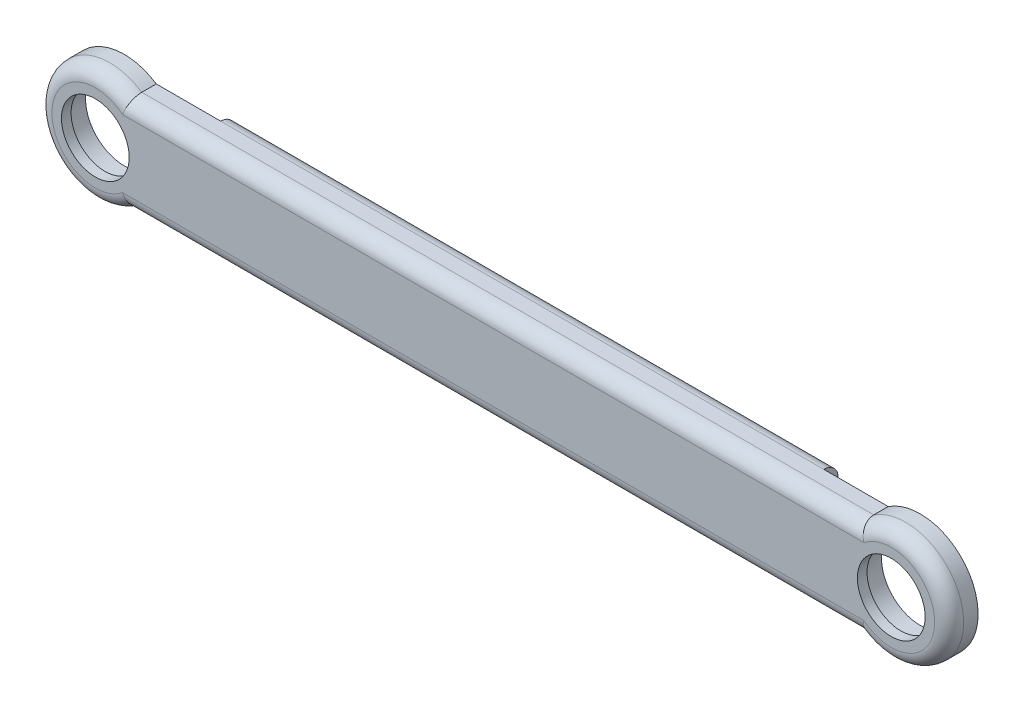
ISO-10303-21;
HEADER;
FILE_DESCRIPTION(('STEP AP214'),'2;1');
FILE_NAME('part.step','',(''),(''),'','','');
FILE_SCHEMA(('AUTOMOTIVE_DESIGN { 1 0 10303 214 1 1 1 1 }'));
ENDSEC;
DATA;
#1=APPLICATION_CONTEXT('core data for automotive mechanical design processes');
#2=APPLICATION_PROTOCOL_DEFINITION('international standard','automotive_design',2000,#1);
#3=PRODUCT_CONTEXT('',#1,'mechanical');
#4=PRODUCT('Part','Part','',(#3));
#5=PRODUCT_RELATED_PRODUCT_CATEGORY('part','',(#4));
#6=PRODUCT_DEFINITION_FORMATION('','',#4);
#7=PRODUCT_DEFINITION_CONTEXT('part definition',#1,'design');
#8=PRODUCT_DEFINITION('design','',#6,#7);
#9=PRODUCT_DEFINITION_SHAPE('','',#8);
#10=(LENGTH_UNIT() NAMED_UNIT(*) SI_UNIT(.MILLI.,.METRE.));
#11=(NAMED_UNIT(*) PLANE_ANGLE_UNIT() SI_UNIT($,.RADIAN.));
#12=(NAMED_UNIT(*) SI_UNIT($,.STERADIAN.) SOLID_ANGLE_UNIT());
#13=UNCERTAINTY_MEASURE_WITH_UNIT(LENGTH_MEASURE(1.E-05),#10,'distance_accuracy_value','');
#14=(GEOMETRIC_REPRESENTATION_CONTEXT(3) GLOBAL_UNCERTAINTY_ASSIGNED_CONTEXT((#13)) GLOBAL_UNIT_ASSIGNED_CONTEXT((#10,
#11,#12)) REPRESENTATION_CONTEXT('',''));
#15=CARTESIAN_POINT('',(0.,0.,0.));
#16=DIRECTION('',(0.,0.,1.));
#17=DIRECTION('',(1.,0.,0.));
#18=AXIS2_PLACEMENT_3D('',#15,#16,#17);
#19=CARTESIAN_POINT('',(-17.9046469247353,-12.01,3.));
#20=DIRECTION('',(0.,0.,1.));
#21=DIRECTION('',(1.,0.,0.));
#22=AXIS2_PLACEMENT_3D('',#19,#20,#21);
#23=PLANE('',#22);
#24=CARTESIAN_POINT('',(0.,0.,3.));
#25=DIRECTION('',(0.,0.,1.));
#26=DIRECTION('',(1.,0.,0.));
#27=AXIS2_PLACEMENT_3D('',#24,#25,#26);
#28=CIRCLE('',#27,8.025);
#29=CARTESIAN_POINT('',(-8.025,0.,3.));
#30=VERTEX_POINT('',#29);
#31=EDGE_CURVE('E174',#30,#30,#28,.T.);
#32=ORIENTED_EDGE('',*,*,#31,.T.);
#33=EDGE_LOOP('',(#32));
#34=FACE_BOUND('',#33,.T.);
#35=DIRECTION('',(1.,0.,0.));
#36=VECTOR('',#35,1.);
#37=CARTESIAN_POINT('',(6.6332495807108,10.,3.));
#38=LINE('',#37,#36);
#39=CARTESIAN_POINT('',(20.,10.,3.));
#40=VERTEX_POINT('',#39);
#41=CARTESIAN_POINT('',(6.6332495807108,10.,3.));
#42=VERTEX_POINT('',#41);
#43=EDGE_CURVE('E134',#40,#42,#38,.F.);
#44=ORIENTED_EDGE('',*,*,#43,.F.);
#45=DIRECTION('',(0.,1.,0.));
#46=VECTOR('',#45,1.);
#47=CARTESIAN_POINT('',(20.,-12.01,3.));
#48=LINE('',#47,#46);
#49=CARTESIAN_POINT('',(20.,-10.,3.));
#50=VERTEX_POINT('',#49);
#51=EDGE_CURVE('E50',#50,#40,#48,.T.);
#52=ORIENTED_EDGE('',*,*,#51,.F.);
#53=DIRECTION('',(1.,0.,0.));
#54=VECTOR('',#53,1.);
#55=CARTESIAN_POINT('',(6.6332495807108,-10.,3.));
#56=LINE('',#55,#54);
#57=CARTESIAN_POINT('',(6.6332495807108,-10.,3.));
#58=VERTEX_POINT('',#57);
#59=EDGE_CURVE('E123',#58,#50,#56,.T.);
#60=ORIENTED_EDGE('',*,*,#59,.F.);
#61=CARTESIAN_POINT('',(0.,0.,3.));
#62=DIRECTION('',(0.,0.,1.));
#63=DIRECTION('',(1.,0.,0.));
#64=AXIS2_PLACEMENT_3D('',#61,#62,#63);
#65=CIRCLE('',#64,12.);
#66=EDGE_CURVE('E70',#42,#58,#65,.T.);
#67=ORIENTED_EDGE('',*,*,#66,.F.);
#68=EDGE_LOOP('',(#44,#52,#60,#67));
#69=FACE_BOUND('',#68,.T.);
#70=CARTESIAN_POINT('',(13.,0.,3.));
#71=DIRECTION('',(0.,0.,1.));
#72=DIRECTION('',(1.,0.,0.));
#73=AXIS2_PLACEMENT_3D('',#70,#71,#72);
#74=CIRCLE('',#73,2.2);
#75=CARTESIAN_POINT('',(15.2,0.,3.));
#76=VERTEX_POINT('',#75);
#77=EDGE_CURVE('E137',#76,#76,#74,.T.);
#78=ORIENTED_EDGE('',*,*,#77,.T.);
#79=EDGE_LOOP('',(#78));
#80=FACE_BOUND('',#79,.T.);
#81=ADVANCED_FACE('F43',(#34,#69,#80),#23,.F.);
#82=CARTESIAN_POINT('',(20.,-12.01,3.));
#83=DIRECTION('',(1.,0.,0.));
#84=DIRECTION('',(0.,0.,-1.));
#85=AXIS2_PLACEMENT_3D('',#82,#83,#84);
#86=PLANE('',#85);
#87=CARTESIAN_POINT('',(20.,7.,3.));
#88=DIRECTION('',(1.,0.,0.));
#89=DIRECTION('',(0.,0.,-1.));
#90=AXIS2_PLACEMENT_3D('',#87,#88,#89);
#91=CIRCLE('',#90,3.);
#92=CARTESIAN_POINT('',(20.,7.,0.));
#93=VERTEX_POINT('',#92);
#94=EDGE_CURVE('E150',#40,#93,#91,.F.);
#95=ORIENTED_EDGE('',*,*,#94,.T.);
#96=DIRECTION('',(0.,1.,0.));
#97=VECTOR('',#96,1.);
#98=CARTESIAN_POINT('',(20.,0.,0.));
#99=LINE('',#98,#97);
#100=CARTESIAN_POINT('',(20.,-7.,0.));
#101=VERTEX_POINT('',#100);
#102=EDGE_CURVE('E142',#101,#93,#99,.T.);
#103=ORIENTED_EDGE('',*,*,#102,.F.);
#104=CARTESIAN_POINT('',(20.,-7.,3.));
#105=DIRECTION('',(1.,0.,0.));
#106=DIRECTION('',(0.,0.,-1.));
#107=AXIS2_PLACEMENT_3D('',#104,#105,#106);
#108=CIRCLE('',#107,3.);
#109=EDGE_CURVE('E141',#101,#50,#108,.F.);
#110=ORIENTED_EDGE('',*,*,#109,.T.);
#111=ORIENTED_EDGE('',*,*,#51,.T.);
#112=EDGE_LOOP('',(#95,#103,#110,#111));
#113=FACE_BOUND('',#112,.T.);
#114=ADVANCED_FACE('F145',(#113),#86,.F.);
#115=CARTESIAN_POINT('',(182.904646924735,-12.01,3.));
#116=DIRECTION('',(0.,0.,-1.));
#117=DIRECTION('',(-1.,0.,0.));
#118=AXIS2_PLACEMENT_3D('',#115,#116,#117);
#119=PLANE('',#118);
#120=CARTESIAN_POINT('',(165.,0.,3.));
#121=DIRECTION('',(0.,0.,-1.));
#122=DIRECTION('',(-1.,0.,0.));
#123=AXIS2_PLACEMENT_3D('',#120,#121,#122);
#124=CIRCLE('',#123,8.025);
#125=CARTESIAN_POINT('',(156.975,0.,3.));
#126=VERTEX_POINT('',#125);
#127=EDGE_CURVE('E173',#126,#126,#124,.F.);
#128=ORIENTED_EDGE('',*,*,#127,.T.);
#129=EDGE_LOOP('',(#128));
#130=FACE_BOUND('',#129,.T.);
#131=CARTESIAN_POINT('',(158.366750419289,10.,3.));
#132=VERTEX_POINT('',#131);
#133=CARTESIAN_POINT('',(145.,10.,3.));
#134=VERTEX_POINT('',#133);
#135=EDGE_CURVE('E153',#132,#134,#38,.F.);
#136=ORIENTED_EDGE('',*,*,#135,.F.);
#137=CARTESIAN_POINT('',(165.,0.,3.));
#138=DIRECTION('',(0.,0.,1.));
#139=DIRECTION('',(1.,0.,0.));
#140=AXIS2_PLACEMENT_3D('',#137,#138,#139);
#141=CIRCLE('',#140,12.);
#142=CARTESIAN_POINT('',(158.366750419289,-10.,3.));
#143=VERTEX_POINT('',#142);
#144=EDGE_CURVE('E158',#143,#132,#141,.T.);
#145=ORIENTED_EDGE('',*,*,#144,.F.);
#146=CARTESIAN_POINT('',(145.,-10.,3.));
#147=VERTEX_POINT('',#146);
#148=EDGE_CURVE('E127',#147,#143,#56,.T.);
#149=ORIENTED_EDGE('',*,*,#148,.F.);
#150=DIRECTION('',(0.,1.,0.));
#151=VECTOR('',#150,1.);
#152=CARTESIAN_POINT('',(145.,-12.01,3.));
#153=LINE('',#152,#151);
#154=EDGE_CURVE('E11',#147,#134,#153,.T.);
#155=ORIENTED_EDGE('',*,*,#154,.T.);
#156=EDGE_LOOP('',(#136,#145,#149,#155));
#157=FACE_BOUND('',#156,.T.);
#158=CARTESIAN_POINT('',(152.,0.,3.));
#159=DIRECTION('',(0.,0.,-1.));
#160=DIRECTION('',(-1.,0.,0.));
#161=AXIS2_PLACEMENT_3D('',#158,#159,#160);
#162=CIRCLE('',#161,2.20000000000001);
#163=CARTESIAN_POINT('',(149.8,0.,3.));
#164=VERTEX_POINT('',#163);
#165=EDGE_CURVE('E151',#164,#164,#162,.T.);
#166=ORIENTED_EDGE('',*,*,#165,.F.);
#167=EDGE_LOOP('',(#166));
#168=FACE_BOUND('',#167,.T.);
#169=ADVANCED_FACE('F206',(#130,#157,#168),#119,.T.);
#170=CARTESIAN_POINT('',(145.,-12.01,3.));
#171=DIRECTION('',(1.,0.,0.));
#172=DIRECTION('',(0.,0.,-1.));
#173=AXIS2_PLACEMENT_3D('',#170,#171,#172);
#174=PLANE('',#173);
#175=CARTESIAN_POINT('',(145.,7.00000000000002,3.));
#176=DIRECTION('',(1.,0.,0.));
#177=DIRECTION('',(0.,0.,-1.));
#178=AXIS2_PLACEMENT_3D('',#175,#176,#177);
#179=CIRCLE('',#178,3.);
#180=CARTESIAN_POINT('',(145.,7.00000000000002,0.));
#181=VERTEX_POINT('',#180);
#182=EDGE_CURVE('E168',#134,#181,#179,.F.);
#183=ORIENTED_EDGE('',*,*,#182,.F.);
#184=ORIENTED_EDGE('',*,*,#154,.F.);
#185=CARTESIAN_POINT('',(145.,-7.00000000000002,3.));
#186=DIRECTION('',(1.,0.,0.));
#187=DIRECTION('',(0.,0.,-1.));
#188=AXIS2_PLACEMENT_3D('',#185,#186,#187);
#189=CIRCLE('',#188,3.);
#190=CARTESIAN_POINT('',(145.,-7.00000000000002,0.));
#191=VERTEX_POINT('',#190);
#192=EDGE_CURVE('E152',#191,#147,#189,.F.);
#193=ORIENTED_EDGE('',*,*,#192,.F.);
#194=DIRECTION('',(0.,1.,0.));
#195=VECTOR('',#194,1.);
#196=CARTESIAN_POINT('',(145.,0.,0.));
#197=LINE('',#196,#195);
#198=EDGE_CURVE('E166',#191,#181,#197,.T.);
#199=ORIENTED_EDGE('',*,*,#198,.T.);
#200=EDGE_LOOP('',(#183,#184,#193,#199));
#201=FACE_BOUND('',#200,.T.);
#202=ADVANCED_FACE('F250',(#201),#174,.T.);
#203=CARTESIAN_POINT('',(152.,0.,8.5));
#204=DIRECTION('',(0.,0.,-1.));
#205=DIRECTION('',(-1.,0.,0.));
#206=AXIS2_PLACEMENT_3D('',#203,#204,#205);
#207=PLANE('',#206);
#208=CARTESIAN_POINT('',(152.,0.,8.5));
#209=DIRECTION('',(0.,0.,-1.));
#210=DIRECTION('',(-1.,0.,0.));
#211=AXIS2_PLACEMENT_3D('',#208,#209,#210);
#212=CIRCLE('',#211,2.20000000000001);
#213=CARTESIAN_POINT('',(149.8,0.,8.5));
#214=VERTEX_POINT('',#213);
#215=EDGE_CURVE('E298',#214,#214,#212,.T.);
#216=ORIENTED_EDGE('',*,*,#215,.T.);
#217=EDGE_LOOP('',(#216));
#218=FACE_BOUND('',#217,.T.);
#219=ADVANCED_FACE('F323',(#218),#207,.T.);
#220=CARTESIAN_POINT('',(152.,0.,8.5));
#221=DIRECTION('',(0.,0.,-1.));
#222=DIRECTION('',(-1.,0.,0.));
#223=AXIS2_PLACEMENT_3D('',#220,#221,#222);
#224=CYLINDRICAL_SURFACE('',#223,2.20000000000001);
#225=ORIENTED_EDGE('',*,*,#215,.F.);
#226=EDGE_LOOP('',(#225));
#227=FACE_BOUND('',#226,.T.);
#228=ORIENTED_EDGE('',*,*,#165,.T.);
#229=EDGE_LOOP('',(#228));
#230=FACE_BOUND('',#229,.T.);
#231=ADVANCED_FACE('F200',(#227,#230),#224,.F.);
#232=CARTESIAN_POINT('',(13.,0.,8.5));
#233=DIRECTION('',(0.,0.,1.));
#234=DIRECTION('',(1.,0.,0.));
#235=AXIS2_PLACEMENT_3D('',#232,#233,#234);
#236=PLANE('',#235);
#237=CARTESIAN_POINT('',(13.,0.,8.5));
#238=DIRECTION('',(0.,0.,1.));
#239=DIRECTION('',(1.,0.,0.));
#240=AXIS2_PLACEMENT_3D('',#237,#238,#239);
#241=CIRCLE('',#240,2.2);
#242=CARTESIAN_POINT('',(15.2,0.,8.5));
#243=VERTEX_POINT('',#242);
#244=EDGE_CURVE('E55',#243,#243,#241,.T.);
#245=ORIENTED_EDGE('',*,*,#244,.F.);
#246=EDGE_LOOP('',(#245));
#247=FACE_BOUND('',#246,.T.);
#248=ADVANCED_FACE('F187',(#247),#236,.F.);
#249=CARTESIAN_POINT('',(13.,0.,8.5));
#250=DIRECTION('',(0.,0.,-1.));
#251=DIRECTION('',(-1.,0.,0.));
#252=AXIS2_PLACEMENT_3D('',#249,#250,#251);
#253=CYLINDRICAL_SURFACE('',#252,2.2);
#254=ORIENTED_EDGE('',*,*,#244,.T.);
#255=EDGE_LOOP('',(#254));
#256=FACE_BOUND('',#255,.T.);
#257=ORIENTED_EDGE('',*,*,#77,.F.);
#258=EDGE_LOOP('',(#257));
#259=FACE_BOUND('',#258,.T.);
#260=ADVANCED_FACE('F184',(#256,#259),#253,.F.);
#261=CARTESIAN_POINT('',(0.,0.,0.));
#262=DIRECTION('',(0.,0.,1.));
#263=DIRECTION('',(1.,0.,0.));
#264=AXIS2_PLACEMENT_3D('',#261,#262,#263);
#265=PLANE('',#264);
#266=DIRECTION('',(1.,0.,0.));
#267=VECTOR('',#266,1.);
#268=CARTESIAN_POINT('',(0.,-7.,0.));
#269=LINE('',#268,#267);
#270=EDGE_CURVE('E178',#191,#101,#269,.F.);
#271=ORIENTED_EDGE('',*,*,#270,.T.);
#272=ORIENTED_EDGE('',*,*,#102,.T.);
#273=DIRECTION('',(1.,0.,0.));
#274=VECTOR('',#273,1.);
#275=CARTESIAN_POINT('',(158.366750419289,7.00000000000002,0.));
#276=LINE('',#275,#274);
#277=EDGE_CURVE('E172',#93,#181,#276,.T.);
#278=ORIENTED_EDGE('',*,*,#277,.T.);
#279=ORIENTED_EDGE('',*,*,#198,.F.);
#280=EDGE_LOOP('',(#271,#272,#278,#279));
#281=FACE_BOUND('',#280,.T.);
#282=ADVANCED_FACE('F190',(#281),#265,.F.);
#283=CARTESIAN_POINT('',(165.,0.,31.6981276760882));
#284=DIRECTION('',(0.,0.,-1.));
#285=DIRECTION('',(-1.,0.,0.));
#286=AXIS2_PLACEMENT_3D('',#283,#284,#285);
#287=CYLINDRICAL_SURFACE('',#286,8.025);
#288=CARTESIAN_POINT('',(165.,0.,7.));
#289=DIRECTION('',(0.,0.,1.));
#290=DIRECTION('',(1.,0.,0.));
#291=AXIS2_PLACEMENT_3D('',#288,#289,#290);
#292=CIRCLE('',#291,8.025);
#293=CARTESIAN_POINT('',(156.975,0.,7.));
#294=VERTEX_POINT('',#293);
#295=EDGE_CURVE('E282',#294,#294,#292,.F.);
#296=CARTESIAN_POINT('',(156.975,0.,7.));
#297=CARTESIAN_POINT('',(156.975,0.,6.95833333333333));
#298=CARTESIAN_POINT('',(156.975,0.,6.91666666666666));
#299=CARTESIAN_POINT('',(156.975,0.,6.83333333333333));
#300=CARTESIAN_POINT('',(156.975,0.,6.79166666666666));
#301=CARTESIAN_POINT('',(156.975,0.,6.70833333333333));
#302=CARTESIAN_POINT('',(156.975,0.,6.66666666666666));
#303=CARTESIAN_POINT('',(156.975,0.,6.58333333333333));
#304=CARTESIAN_POINT('',(156.975,0.,6.54166666666666));
#305=CARTESIAN_POINT('',(156.975,0.,6.45833333333333));
#306=CARTESIAN_POINT('',(156.975,0.,6.41666666666666));
#307=CARTESIAN_POINT('',(156.975,0.,6.33333333333333));
#308=CARTESIAN_POINT('',(156.975,0.,6.29166666666666));
#309=CARTESIAN_POINT('',(156.975,0.,6.20833333333333));
#310=CARTESIAN_POINT('',(156.975,0.,6.16666666666666));
#311=CARTESIAN_POINT('',(156.975,0.,6.08333333333333));
#312=CARTESIAN_POINT('',(156.975,0.,6.04166666666666));
#313=CARTESIAN_POINT('',(156.975,0.,5.95833333333333));
#314=CARTESIAN_POINT('',(156.975,0.,5.91666666666666));
#315=CARTESIAN_POINT('',(156.975,0.,5.83333333333333));
#316=CARTESIAN_POINT('',(156.975,0.,5.79166666666666));
#317=CARTESIAN_POINT('',(156.975,0.,5.70833333333333));
#318=CARTESIAN_POINT('',(156.975,0.,5.66666666666666));
#319=CARTESIAN_POINT('',(156.975,0.,5.58333333333333));
#320=CARTESIAN_POINT('',(156.975,0.,5.54166666666666));
#321=CARTESIAN_POINT('',(156.975,0.,5.45833333333333));
#322=CARTESIAN_POINT('',(156.975,0.,5.41666666666666));
#323=CARTESIAN_POINT('',(156.975,0.,5.33333333333333));
#324=CARTESIAN_POINT('',(156.975,0.,5.29166666666666));
#325=CARTESIAN_POINT('',(156.975,0.,5.20833333333333));
#326=CARTESIAN_POINT('',(156.975,0.,5.16666666666666));
#327=CARTESIAN_POINT('',(156.975,0.,5.08333333333333));
#328=CARTESIAN_POINT('',(156.975,0.,5.04166666666666));
#329=CARTESIAN_POINT('',(156.975,0.,4.95833333333333));
#330=CARTESIAN_POINT('',(156.975,0.,4.91666666666666));
#331=CARTESIAN_POINT('',(156.975,0.,4.83333333333333));
#332=CARTESIAN_POINT('',(156.975,0.,4.79166666666666));
#333=CARTESIAN_POINT('',(156.975,0.,4.70833333333333));
#334=CARTESIAN_POINT('',(156.975,0.,4.66666666666666));
#335=CARTESIAN_POINT('',(156.975,0.,4.58333333333333));
#336=CARTESIAN_POINT('',(156.975,0.,4.54166666666666));
#337=CARTESIAN_POINT('',(156.975,0.,4.45833333333333));
#338=CARTESIAN_POINT('',(156.975,0.,4.41666666666666));
#339=CARTESIAN_POINT('',(156.975,0.,4.33333333333333));
#340=CARTESIAN_POINT('',(156.975,0.,4.29166666666666));
#341=CARTESIAN_POINT('',(156.975,0.,4.20833333333333));
#342=CARTESIAN_POINT('',(156.975,0.,4.16666666666667));
#343=CARTESIAN_POINT('',(156.975,0.,4.08333333333333));
#344=CARTESIAN_POINT('',(156.975,0.,4.04166666666667));
#345=CARTESIAN_POINT('',(156.975,0.,3.95833333333333));
#346=CARTESIAN_POINT('',(156.975,0.,3.91666666666667));
#347=CARTESIAN_POINT('',(156.975,0.,3.83333333333333));
#348=CARTESIAN_POINT('',(156.975,0.,3.79166666666667));
#349=CARTESIAN_POINT('',(156.975,0.,3.70833333333333));
#350=CARTESIAN_POINT('',(156.975,0.,3.66666666666667));
#351=CARTESIAN_POINT('',(156.975,0.,3.58333333333333));
#352=CARTESIAN_POINT('',(156.975,0.,3.54166666666667));
#353=CARTESIAN_POINT('',(156.975,0.,3.45833333333333));
#354=CARTESIAN_POINT('',(156.975,0.,3.41666666666667));
#355=CARTESIAN_POINT('',(156.975,0.,3.33333333333333));
#356=CARTESIAN_POINT('',(156.975,0.,3.29166666666667));
#357=CARTESIAN_POINT('',(156.975,0.,3.20833333333333));
#358=CARTESIAN_POINT('',(156.975,0.,3.16666666666667));
#359=CARTESIAN_POINT('',(156.975,0.,3.08333333333333));
#360=CARTESIAN_POINT('',(156.975,0.,3.04166666666667));
#361=CARTESIAN_POINT('',(156.975,0.,3.));
#362=B_SPLINE_CURVE_WITH_KNOTS('',3,(#296,#297,#298,#299,#300,#301,#302,#303,#304,#305,#306,
#307,#308,#309,#310,#311,#312,#313,#314,#315,#316,#317,#318,#319,#320,#321,#322,#323,#324,#325,
#326,#327,#328,#329,#330,#331,#332,#333,#334,#335,#336,#337,#338,#339,#340,#341,#342,#343,#344,
#345,#346,#347,#348,#349,#350,#351,#352,#353,#354,#355,#356,#357,#358,#359,#360,#361),
.UNSPECIFIED.,.F.,.F.,(4,2,2,2,2,2,2,2,2,2,2,2,2,2,2,2,2,2,2,2,2,2,2,2,2,2,2,2,2,2,2,2,4),(0.,
0.125,0.25,0.375,0.5,0.625000000000001,0.750000000000001,0.875000000000001,1.,1.125,1.25,1.375,
1.5,1.625,1.75,1.875,2.,2.125,2.25,2.375,2.5,2.625,2.75,2.875,3.,3.125,3.25,3.375,3.5,3.625,
3.75,3.875,4.),.UNSPECIFIED.);
#363=EDGE_CURVE('BSEAM193',#294,#126,#362,.T.);
#364=ORIENTED_EDGE('',*,*,#295,.F.);
#365=ORIENTED_EDGE('',*,*,#127,.F.);
#366=ORIENTED_EDGE('',*,*,#363,.T.);
#367=ORIENTED_EDGE('',*,*,#363,.F.);
#368=EDGE_LOOP('',(#364,#366,#365,#367));
#369=FACE_BOUND('',#368,.T.);
#370=ADVANCED_FACE('F193',(#369),#287,.F.);
#371=CARTESIAN_POINT('',(0.,7.,3.));
#372=DIRECTION('',(-1.,0.,0.));
#373=DIRECTION('',(0.,-1.,0.));
#374=AXIS2_PLACEMENT_3D('',#371,#372,#373);
#375=CYLINDRICAL_SURFACE('',#374,3.);
#376=ORIENTED_EDGE('',*,*,#94,.F.);
#377=EDGE_CURVE('E156',#134,#40,#38,.F.);
#378=ORIENTED_EDGE('',*,*,#377,.F.);
#379=ORIENTED_EDGE('',*,*,#182,.T.);
#380=ORIENTED_EDGE('',*,*,#277,.F.);
#381=EDGE_LOOP('',(#376,#378,#379,#380));
#382=FACE_BOUND('',#381,.T.);
#383=ADVANCED_FACE('F241',(#382),#375,.T.);
#384=CARTESIAN_POINT('',(6.6332495807108,-7.,3.));
#385=DIRECTION('',(1.,0.,0.));
#386=DIRECTION('',(0.,1.,0.));
#387=AXIS2_PLACEMENT_3D('',#384,#385,#386);
#388=CYLINDRICAL_SURFACE('',#387,3.);
#389=ORIENTED_EDGE('',*,*,#109,.F.);
#390=ORIENTED_EDGE('',*,*,#270,.F.);
#391=ORIENTED_EDGE('',*,*,#192,.T.);
#392=EDGE_CURVE('E124',#50,#147,#56,.T.);
#393=ORIENTED_EDGE('',*,*,#392,.F.);
#394=EDGE_LOOP('',(#389,#390,#391,#393));
#395=FACE_BOUND('',#394,.T.);
#396=ADVANCED_FACE('F148',(#395),#388,.T.);
#397=CARTESIAN_POINT('',(0.,0.,9.));
#398=DIRECTION('',(0.,0.,1.));
#399=DIRECTION('',(1.,0.,0.));
#400=AXIS2_PLACEMENT_3D('',#397,#398,#399);
#401=PLANE('',#400);
#402=CARTESIAN_POINT('',(0.,0.,9.));
#403=DIRECTION('',(0.,0.,1.));
#404=DIRECTION('',(1.,0.,0.));
#405=AXIS2_PLACEMENT_3D('',#402,#403,#404);
#406=CIRCLE('',#405,9.);
#407=CARTESIAN_POINT('',(5.65685424949238,7.,9.));
#408=VERTEX_POINT('',#407);
#409=CARTESIAN_POINT('',(5.65685424949238,-7.,9.));
#410=VERTEX_POINT('',#409);
#411=EDGE_CURVE('E543',#408,#410,#406,.T.);
#412=ORIENTED_EDGE('',*,*,#411,.T.);
#413=DIRECTION('',(1.,0.,0.));
#414=VECTOR('',#413,1.);
#415=CARTESIAN_POINT('',(158.366750419289,-7.00000000000002,9.));
#416=LINE('',#415,#414);
#417=CARTESIAN_POINT('',(159.343145750508,-7.00000000000001,9.));
#418=VERTEX_POINT('',#417);
#419=EDGE_CURVE('E163',#410,#418,#416,.T.);
#420=ORIENTED_EDGE('',*,*,#419,.T.);
#421=CARTESIAN_POINT('',(165.,0.,9.));
#422=DIRECTION('',(0.,0.,1.));
#423=DIRECTION('',(1.,0.,0.));
#424=AXIS2_PLACEMENT_3D('',#421,#422,#423);
#425=CIRCLE('',#424,9.00000000000003);
#426=CARTESIAN_POINT('',(159.343145750508,7.00000000000002,9.));
#427=VERTEX_POINT('',#426);
#428=EDGE_CURVE('E265',#418,#427,#425,.T.);
#429=ORIENTED_EDGE('',*,*,#428,.T.);
#430=DIRECTION('',(1.,0.,0.));
#431=VECTOR('',#430,1.);
#432=CARTESIAN_POINT('',(0.,7.,9.));
#433=LINE('',#432,#431);
#434=EDGE_CURVE('E165',#427,#408,#433,.F.);
#435=ORIENTED_EDGE('',*,*,#434,.T.);
#436=EDGE_LOOP('',(#412,#420,#429,#435));
#437=FACE_BOUND('',#436,.T.);
#438=CARTESIAN_POINT('',(165.,0.,9.));
#439=DIRECTION('',(0.,0.,-1.));
#440=DIRECTION('',(-1.,0.,0.));
#441=AXIS2_PLACEMENT_3D('',#438,#439,#440);
#442=CIRCLE('',#441,7.025);
#443=CARTESIAN_POINT('',(157.975,0.,9.));
#444=VERTEX_POINT('',#443);
#445=EDGE_CURVE('E239',#444,#444,#442,.T.);
#446=ORIENTED_EDGE('',*,*,#445,.T.);
#447=EDGE_LOOP('',(#446));
#448=FACE_BOUND('',#447,.T.);
#449=CARTESIAN_POINT('',(0.,0.,9.));
#450=DIRECTION('',(0.,0.,1.));
#451=DIRECTION('',(1.,0.,0.));
#452=AXIS2_PLACEMENT_3D('',#449,#450,#451);
#453=CIRCLE('',#452,7.025);
#454=CARTESIAN_POINT('',(7.025,0.,9.));
#455=VERTEX_POINT('',#454);
#456=EDGE_CURVE('E294',#455,#455,#453,.T.);
#457=ORIENTED_EDGE('',*,*,#456,.F.);
#458=EDGE_LOOP('',(#457));
#459=FACE_BOUND('',#458,.T.);
#460=ADVANCED_FACE('F353',(#437,#448,#459),#401,.T.);
#461=CARTESIAN_POINT('',(0.,0.,9.));
#462=DIRECTION('',(0.,0.,-1.));
#463=DIRECTION('',(-1.,0.,0.));
#464=AXIS2_PLACEMENT_3D('',#461,#462,#463);
#465=CYLINDRICAL_SURFACE('',#464,12.);
#466=DIRECTION('',(0.,0.,-1.));
#467=VECTOR('',#466,1.);
#468=CARTESIAN_POINT('',(6.6332495807108,10.,9.));
#469=LINE('',#468,#467);
#470=CARTESIAN_POINT('',(6.6332495807108,10.,6.));
#471=VERTEX_POINT('',#470);
#472=EDGE_CURVE('E283',#471,#42,#469,.T.);
#473=ORIENTED_EDGE('',*,*,#472,.T.);
#474=ORIENTED_EDGE('',*,*,#66,.T.);
#475=DIRECTION('',(0.,0.,-1.));
#476=VECTOR('',#475,1.);
#477=CARTESIAN_POINT('',(6.6332495807108,-10.,9.));
#478=LINE('',#477,#476);
#479=CARTESIAN_POINT('',(6.6332495807108,-10.,6.));
#480=VERTEX_POINT('',#479);
#481=EDGE_CURVE('E128',#480,#58,#478,.T.);
#482=ORIENTED_EDGE('',*,*,#481,.F.);
#483=CARTESIAN_POINT('',(0.,0.,6.));
#484=DIRECTION('',(0.,0.,1.));
#485=DIRECTION('',(1.,0.,0.));
#486=AXIS2_PLACEMENT_3D('',#483,#484,#485);
#487=CIRCLE('',#486,12.);
#488=EDGE_CURVE('E272',#480,#471,#487,.F.);
#489=ORIENTED_EDGE('',*,*,#488,.T.);
#490=EDGE_LOOP('',(#473,#474,#482,#489));
#491=FACE_BOUND('',#490,.T.);
#492=ADVANCED_FACE('F352',(#491),#465,.T.);
#493=CARTESIAN_POINT('',(6.6332495807108,-10.,9.));
#494=DIRECTION('',(0.,1.,0.));
#495=DIRECTION('',(-1.,0.,0.));
#496=AXIS2_PLACEMENT_3D('',#493,#494,#495);
#497=PLANE('',#496);
#498=ORIENTED_EDGE('',*,*,#481,.T.);
#499=ORIENTED_EDGE('',*,*,#59,.T.);
#500=ORIENTED_EDGE('',*,*,#392,.T.);
#501=ORIENTED_EDGE('',*,*,#148,.T.);
#502=DIRECTION('',(0.,0.,-1.));
#503=VECTOR('',#502,1.);
#504=CARTESIAN_POINT('',(158.366750419289,-10.,9.));
#505=LINE('',#504,#503);
#506=CARTESIAN_POINT('',(158.366750419289,-10.,6.));
#507=VERTEX_POINT('',#506);
#508=EDGE_CURVE('E255',#507,#143,#505,.T.);
#509=ORIENTED_EDGE('',*,*,#508,.F.);
#510=DIRECTION('',(1.,0.,0.));
#511=VECTOR('',#510,1.);
#512=CARTESIAN_POINT('',(6.6332495807108,-10.,6.));
#513=LINE('',#512,#511);
#514=EDGE_CURVE('E58',#507,#480,#513,.F.);
#515=ORIENTED_EDGE('',*,*,#514,.T.);
#516=EDGE_LOOP('',(#498,#499,#500,#501,#509,#515));
#517=FACE_BOUND('',#516,.T.);
#518=ADVANCED_FACE('F121',(#517),#497,.F.);
#519=CARTESIAN_POINT('',(165.,0.,9.));
#520=DIRECTION('',(0.,0.,-1.));
#521=DIRECTION('',(-1.,0.,0.));
#522=AXIS2_PLACEMENT_3D('',#519,#520,#521);
#523=CYLINDRICAL_SURFACE('',#522,12.);
#524=ORIENTED_EDGE('',*,*,#508,.T.);
#525=ORIENTED_EDGE('',*,*,#144,.T.);
#526=DIRECTION('',(0.,0.,-1.));
#527=VECTOR('',#526,1.);
#528=CARTESIAN_POINT('',(158.366750419289,10.,9.));
#529=LINE('',#528,#527);
#530=CARTESIAN_POINT('',(158.366750419289,10.,6.));
#531=VERTEX_POINT('',#530);
#532=EDGE_CURVE('E258',#531,#132,#529,.T.);
#533=ORIENTED_EDGE('',*,*,#532,.F.);
#534=CARTESIAN_POINT('',(165.,0.,6.));
#535=DIRECTION('',(0.,0.,1.));
#536=DIRECTION('',(1.,0.,0.));
#537=AXIS2_PLACEMENT_3D('',#534,#535,#536);
#538=CIRCLE('',#537,12.);
#539=EDGE_CURVE('E159',#531,#507,#538,.F.);
#540=ORIENTED_EDGE('',*,*,#539,.T.);
#541=EDGE_LOOP('',(#524,#525,#533,#540));
#542=FACE_BOUND('',#541,.T.);
#543=ADVANCED_FACE('F469',(#542),#523,.T.);
#544=CARTESIAN_POINT('',(6.6332495807108,10.,9.));
#545=DIRECTION('',(0.,1.,0.));
#546=DIRECTION('',(-1.,0.,0.));
#547=AXIS2_PLACEMENT_3D('',#544,#545,#546);
#548=PLANE('',#547);
#549=ORIENTED_EDGE('',*,*,#532,.T.);
#550=ORIENTED_EDGE('',*,*,#135,.T.);
#551=ORIENTED_EDGE('',*,*,#377,.T.);
#552=ORIENTED_EDGE('',*,*,#43,.T.);
#553=ORIENTED_EDGE('',*,*,#472,.F.);
#554=DIRECTION('',(1.,0.,0.));
#555=VECTOR('',#554,1.);
#556=CARTESIAN_POINT('',(6.6332495807108,10.,6.));
#557=LINE('',#556,#555);
#558=EDGE_CURVE('E126',#471,#531,#557,.T.);
#559=ORIENTED_EDGE('',*,*,#558,.T.);
#560=EDGE_LOOP('',(#549,#550,#551,#552,#553,#559));
#561=FACE_BOUND('',#560,.T.);
#562=ADVANCED_FACE('F341',(#561),#548,.T.);
#563=CARTESIAN_POINT('',(165.,0.,9.));
#564=DIRECTION('',(0.,0.,-1.));
#565=DIRECTION('',(-1.,0.,0.));
#566=AXIS2_PLACEMENT_3D('',#563,#564,#565);
#567=CYLINDRICAL_SURFACE('',#566,7.025);
#568=ORIENTED_EDGE('',*,*,#445,.F.);
#569=EDGE_LOOP('',(#568));
#570=FACE_BOUND('',#569,.T.);
#571=CARTESIAN_POINT('',(165.,0.,7.));
#572=DIRECTION('',(0.,0.,1.));
#573=DIRECTION('',(1.,0.,0.));
#574=AXIS2_PLACEMENT_3D('',#571,#572,#573);
#575=CIRCLE('',#574,7.025);
#576=CARTESIAN_POINT('',(172.025,0.,7.));
#577=VERTEX_POINT('',#576);
#578=EDGE_CURVE('E279',#577,#577,#575,.T.);
#579=ORIENTED_EDGE('',*,*,#578,.F.);
#580=EDGE_LOOP('',(#579));
#581=FACE_BOUND('',#580,.T.);
#582=ADVANCED_FACE('F342',(#570,#581),#567,.F.);
#583=CARTESIAN_POINT('',(0.,0.,9.));
#584=DIRECTION('',(0.,0.,-1.));
#585=DIRECTION('',(-1.,0.,0.));
#586=AXIS2_PLACEMENT_3D('',#583,#584,#585);
#587=CYLINDRICAL_SURFACE('',#586,7.025);
#588=ORIENTED_EDGE('',*,*,#456,.T.);
#589=EDGE_LOOP('',(#588));
#590=FACE_BOUND('',#589,.T.);
#591=CARTESIAN_POINT('',(0.,0.,7.));
#592=DIRECTION('',(0.,0.,1.));
#593=DIRECTION('',(1.,0.,0.));
#594=AXIS2_PLACEMENT_3D('',#591,#592,#593);
#595=CIRCLE('',#594,7.025);
#596=CARTESIAN_POINT('',(7.025,0.,7.));
#597=VERTEX_POINT('',#596);
#598=EDGE_CURVE('E280',#597,#597,#595,.F.);
#599=ORIENTED_EDGE('',*,*,#598,.T.);
#600=EDGE_LOOP('',(#599));
#601=FACE_BOUND('',#600,.T.);
#602=ADVANCED_FACE('F44',(#590,#601),#587,.F.);
#603=CARTESIAN_POINT('',(0.,0.,7.));
#604=DIRECTION('',(0.,0.,1.));
#605=DIRECTION('',(1.,0.,0.));
#606=AXIS2_PLACEMENT_3D('',#603,#604,#605);
#607=PLANE('',#606);
#608=ORIENTED_EDGE('',*,*,#578,.T.);
#609=EDGE_LOOP('',(#608));
#610=FACE_BOUND('',#609,.T.);
#611=ORIENTED_EDGE('',*,*,#295,.T.);
#612=EDGE_LOOP('',(#611));
#613=FACE_BOUND('',#612,.T.);
#614=ADVANCED_FACE('F366',(#610,#613),#607,.F.);
#615=CARTESIAN_POINT('',(0.,0.,31.6981276760882));
#616=DIRECTION('',(0.,0.,-1.));
#617=DIRECTION('',(-1.,0.,0.));
#618=AXIS2_PLACEMENT_3D('',#615,#616,#617);
#619=CYLINDRICAL_SURFACE('',#618,8.025);
#620=CARTESIAN_POINT('',(0.,0.,7.));
#621=DIRECTION('',(0.,0.,1.));
#622=DIRECTION('',(1.,0.,0.));
#623=AXIS2_PLACEMENT_3D('',#620,#621,#622);
#624=CIRCLE('',#623,8.025);
#625=CARTESIAN_POINT('',(-8.025,0.,7.));
#626=VERTEX_POINT('',#625);
#627=EDGE_CURVE('E289',#626,#626,#624,.T.);
#628=CARTESIAN_POINT('',(-8.025,0.,3.));
#629=CARTESIAN_POINT('',(-8.025,0.,3.04166666666667));
#630=CARTESIAN_POINT('',(-8.025,0.,3.08333333333333));
#631=CARTESIAN_POINT('',(-8.025,0.,3.16666666666667));
#632=CARTESIAN_POINT('',(-8.025,0.,3.20833333333333));
#633=CARTESIAN_POINT('',(-8.025,0.,3.29166666666667));
#634=CARTESIAN_POINT('',(-8.025,0.,3.33333333333333));
#635=CARTESIAN_POINT('',(-8.025,0.,3.41666666666667));
#636=CARTESIAN_POINT('',(-8.025,0.,3.45833333333333));
#637=CARTESIAN_POINT('',(-8.025,0.,3.54166666666667));
#638=CARTESIAN_POINT('',(-8.025,0.,3.58333333333333));
#639=CARTESIAN_POINT('',(-8.025,0.,3.66666666666667));
#640=CARTESIAN_POINT('',(-8.025,0.,3.70833333333333));
#641=CARTESIAN_POINT('',(-8.025,0.,3.79166666666667));
#642=CARTESIAN_POINT('',(-8.025,0.,3.83333333333333));
#643=CARTESIAN_POINT('',(-8.025,0.,3.91666666666667));
#644=CARTESIAN_POINT('',(-8.025,0.,3.95833333333333));
#645=CARTESIAN_POINT('',(-8.025,0.,4.04166666666667));
#646=CARTESIAN_POINT('',(-8.025,0.,4.08333333333333));
#647=CARTESIAN_POINT('',(-8.025,0.,4.16666666666666));
#648=CARTESIAN_POINT('',(-8.025,0.,4.20833333333333));
#649=CARTESIAN_POINT('',(-8.025,0.,4.29166666666666));
#650=CARTESIAN_POINT('',(-8.025,0.,4.33333333333333));
#651=CARTESIAN_POINT('',(-8.025,0.,4.41666666666666));
#652=CARTESIAN_POINT('',(-8.025,0.,4.45833333333333));
#653=CARTESIAN_POINT('',(-8.025,0.,4.54166666666666));
#654=CARTESIAN_POINT('',(-8.025,0.,4.58333333333333));
#655=CARTESIAN_POINT('',(-8.025,0.,4.66666666666666));
#656=CARTESIAN_POINT('',(-8.025,0.,4.70833333333333));
#657=CARTESIAN_POINT('',(-8.025,0.,4.79166666666666));
#658=CARTESIAN_POINT('',(-8.025,0.,4.83333333333333));
#659=CARTESIAN_POINT('',(-8.025,0.,4.91666666666666));
#660=CARTESIAN_POINT('',(-8.025,0.,4.95833333333333));
#661=CARTESIAN_POINT('',(-8.025,0.,5.04166666666666));
#662=CARTESIAN_POINT('',(-8.025,0.,5.08333333333333));
#663=CARTESIAN_POINT('',(-8.025,0.,5.16666666666666));
#664=CARTESIAN_POINT('',(-8.025,0.,5.20833333333333));
#665=CARTESIAN_POINT('',(-8.025,0.,5.29166666666666));
#666=CARTESIAN_POINT('',(-8.025,0.,5.33333333333333));
#667=CARTESIAN_POINT('',(-8.025,0.,5.41666666666666));
#668=CARTESIAN_POINT('',(-8.025,0.,5.45833333333333));
#669=CARTESIAN_POINT('',(-8.025,0.,5.54166666666666));
#670=CARTESIAN_POINT('',(-8.025,0.,5.58333333333333));
#671=CARTESIAN_POINT('',(-8.025,0.,5.66666666666666));
#672=CARTESIAN_POINT('',(-8.025,0.,5.70833333333333));
#673=CARTESIAN_POINT('',(-8.025,0.,5.79166666666666));
#674=CARTESIAN_POINT('',(-8.025,0.,5.83333333333333));
#675=CARTESIAN_POINT('',(-8.025,0.,5.91666666666666));
#676=CARTESIAN_POINT('',(-8.025,0.,5.95833333333333));
#677=CARTESIAN_POINT('',(-8.025,0.,6.04166666666666));
#678=CARTESIAN_POINT('',(-8.025,0.,6.08333333333333));
#679=CARTESIAN_POINT('',(-8.025,0.,6.16666666666666));
#680=CARTESIAN_POINT('',(-8.025,0.,6.20833333333333));
#681=CARTESIAN_POINT('',(-8.025,0.,6.29166666666666));
#682=CARTESIAN_POINT('',(-8.025,0.,6.33333333333333));
#683=CARTESIAN_POINT('',(-8.025,0.,6.41666666666666));
#684=CARTESIAN_POINT('',(-8.025,0.,6.45833333333333));
#685=CARTESIAN_POINT('',(-8.025,0.,6.54166666666666));
#686=CARTESIAN_POINT('',(-8.025,0.,6.58333333333333));
#687=CARTESIAN_POINT('',(-8.025,0.,6.66666666666666));
#688=CARTESIAN_POINT('',(-8.025,0.,6.70833333333333));
#689=CARTESIAN_POINT('',(-8.025,0.,6.79166666666666));
#690=CARTESIAN_POINT('',(-8.025,0.,6.83333333333333));
#691=CARTESIAN_POINT('',(-8.025,0.,6.91666666666666));
#692=CARTESIAN_POINT('',(-8.025,0.,6.95833333333333));
#693=CARTESIAN_POINT('',(-8.025,0.,7.));
#694=B_SPLINE_CURVE_WITH_KNOTS('',3,(#628,#629,#630,#631,#632,#633,#634,#635,#636,#637,#638,
#639,#640,#641,#642,#643,#644,#645,#646,#647,#648,#649,#650,#651,#652,#653,#654,#655,#656,#657,
#658,#659,#660,#661,#662,#663,#664,#665,#666,#667,#668,#669,#670,#671,#672,#673,#674,#675,#676,
#677,#678,#679,#680,#681,#682,#683,#684,#685,#686,#687,#688,#689,#690,#691,#692,#693),
.UNSPECIFIED.,.F.,.F.,(4,2,2,2,2,2,2,2,2,2,2,2,2,2,2,2,2,2,2,2,2,2,2,2,2,2,2,2,2,2,2,2,4),(0.,
0.125,0.25,0.375,0.5,0.625000000000001,0.750000000000001,0.875000000000001,1.,1.125,1.25,1.375,
1.5,1.625,1.75,1.875,2.,2.125,2.25,2.375,2.5,2.625,2.75,2.875,3.,3.125,3.25,3.375,3.5,3.625,
3.75,3.875,4.),.UNSPECIFIED.);
#695=EDGE_CURVE('BSEAM368',#30,#626,#694,.T.);
#696=ORIENTED_EDGE('',*,*,#31,.F.);
#697=ORIENTED_EDGE('',*,*,#627,.T.);
#698=ORIENTED_EDGE('',*,*,#695,.T.);
#699=ORIENTED_EDGE('',*,*,#695,.F.);
#700=EDGE_LOOP('',(#696,#698,#697,#699));
#701=FACE_BOUND('',#700,.T.);
#702=ADVANCED_FACE('F368',(#701),#619,.F.);
#703=CARTESIAN_POINT('',(0.,0.,7.));
#704=DIRECTION('',(0.,0.,1.));
#705=DIRECTION('',(1.,0.,0.));
#706=AXIS2_PLACEMENT_3D('',#703,#704,#705);
#707=PLANE('',#706);
#708=ORIENTED_EDGE('',*,*,#598,.F.);
#709=EDGE_LOOP('',(#708));
#710=FACE_BOUND('',#709,.T.);
#711=ORIENTED_EDGE('',*,*,#627,.F.);
#712=EDGE_LOOP('',(#711));
#713=FACE_BOUND('',#712,.T.);
#714=ADVANCED_FACE('F220',(#710,#713),#707,.F.);
#715=CARTESIAN_POINT('',(165.,0.,6.));
#716=DIRECTION('',(0.,0.,1.));
#717=DIRECTION('',(1.,0.,0.));
#718=AXIS2_PLACEMENT_3D('',#715,#716,#717);
#719=TOROIDAL_SURFACE('',#718,9.00000000000003,3.);
#720=CARTESIAN_POINT('',(158.366750419289,-10.,6.));
#721=CARTESIAN_POINT('',(158.366748406548,-10.0000098535692,6.08167717188771));
#722=CARTESIAN_POINT('',(158.367756119082,-9.99666455428936,6.16334955424276));
#723=CARTESIAN_POINT('',(158.371775128652,-9.98333938667463,6.32609183130196));
#724=CARTESIAN_POINT('',(158.374786177691,-9.97336033954348,6.40716179932415));
#725=CARTESIAN_POINT('',(158.382788912227,-9.94686684749292,6.56798438045933));
#726=CARTESIAN_POINT('',(158.387777082286,-9.93036400241241,6.64773907145089));
#727=CARTESIAN_POINT('',(158.399698197228,-9.89098718371105,6.80548849774177));
#728=CARTESIAN_POINT('',(158.406631146236,-9.86811319658087,6.88348322930889));
#729=CARTESIAN_POINT('',(158.430293603664,-9.79019724346064,7.1140229760547));
#730=CARTESIAN_POINT('',(158.449893121657,-9.72583993009606,7.26325176013138));
#731=CARTESIAN_POINT('',(158.496248267667,-9.57456313707387,7.54846076672712));
#732=CARTESIAN_POINT('',(158.523004457229,-9.48764188696214,7.68443994847892));
#733=CARTESIAN_POINT('',(158.583564045909,-9.29243006025774,7.94197958183514));
#734=CARTESIAN_POINT('',(158.617476361481,-9.18381078859014,8.06326534366037));
#735=CARTESIAN_POINT('',(158.691315052031,-8.9495361347456,8.28592345680368));
#736=CARTESIAN_POINT('',(158.731243217371,-8.82387568210235,8.38728985920836));
#737=CARTESIAN_POINT('',(158.817979114909,-8.55385703409445,8.57163781091404));
#738=CARTESIAN_POINT('',(158.864999363909,-8.40894912932895,8.6537129721208));
#739=CARTESIAN_POINT('',(158.963614617624,-8.10888057219527,8.79243553794698));
#740=CARTESIAN_POINT('',(159.015209767454,-7.95371959463985,8.84908213562768));
#741=CARTESIAN_POINT('',(159.11169754666,-7.66755910857492,8.92780386846399));
#742=CARTESIAN_POINT('',(159.155999727501,-7.53757385301958,8.95440399544497));
#743=CARTESIAN_POINT('',(159.246227202724,-7.27596866612548,8.99018587534928));
#744=CARTESIAN_POINT('',(159.292149241296,-7.14435232413626,8.99940074278481));
#745=CARTESIAN_POINT('',(159.340075831448,-7.0086847995247,8.99999059500399));
#746=CARTESIAN_POINT('',(159.341610540671,-7.00434221800044,9.00000002380911));
#747=CARTESIAN_POINT('',(159.343145750508,-7.00000000000002,9.));
#748=B_SPLINE_CURVE_WITH_KNOTS('',3,(#720,#721,#722,#723,#724,#725,#726,#727,#728,#729,#730,
#731,#732,#733,#734,#735,#736,#737,#738,#739,#740,#741,#742,#743,#744,#745,#746,#747),
.UNSPECIFIED.,.F.,.F.,(4,2,2,2,2,2,2,2,2,2,2,2,2,4),(0.,0.244948450351612,0.489866583732241,
0.734351177670227,0.97883629001557,1.46742101818896,1.95604409421152,2.45272325799537,
2.94955053024501,3.46641584921098,3.98329756899188,4.40191800726715,4.81974027154333,
4.83355763866565),.UNSPECIFIED.);
#749=EDGE_CURVE('E223',#507,#418,#748,.T.);
#750=ORIENTED_EDGE('',*,*,#749,.F.);
#751=ORIENTED_EDGE('',*,*,#539,.F.);
#752=CARTESIAN_POINT('',(158.366750419289,10.,6.));
#753=CARTESIAN_POINT('',(158.366748406548,10.0000098535692,6.08167717188771));
#754=CARTESIAN_POINT('',(158.367756119082,9.99666455428936,6.16334955424276));
#755=CARTESIAN_POINT('',(158.371775128652,9.98333938667463,6.32609183130196));
#756=CARTESIAN_POINT('',(158.374786177691,9.97336033954348,6.40716179932415));
#757=CARTESIAN_POINT('',(158.382788912227,9.94686684749292,6.56798438045933));
#758=CARTESIAN_POINT('',(158.387777082286,9.93036400241241,6.64773907145089));
#759=CARTESIAN_POINT('',(158.399698197228,9.89098718371105,6.80548849774177));
#760=CARTESIAN_POINT('',(158.406631146236,9.86811319658087,6.88348322930889));
#761=CARTESIAN_POINT('',(158.430293603664,9.79019724346064,7.1140229760547));
#762=CARTESIAN_POINT('',(158.449893121657,9.72583993009606,7.26325176013137));
#763=CARTESIAN_POINT('',(158.496248267667,9.57456313707387,7.54846076672712));
#764=CARTESIAN_POINT('',(158.523004457229,9.48764188696214,7.68443994847892));
#765=CARTESIAN_POINT('',(158.583564045909,9.29243006025774,7.94197958183514));
#766=CARTESIAN_POINT('',(158.617476361481,9.18381078859014,8.06326534366037));
#767=CARTESIAN_POINT('',(158.691315052031,8.9495361347456,8.28592345680368));
#768=CARTESIAN_POINT('',(158.731243217371,8.82387568210235,8.38728985920836));
#769=CARTESIAN_POINT('',(158.817979114909,8.55385703409445,8.57163781091404));
#770=CARTESIAN_POINT('',(158.864999363909,8.40894912932895,8.6537129721208));
#771=CARTESIAN_POINT('',(158.963614617624,8.10888057219527,8.79243553794698));
#772=CARTESIAN_POINT('',(159.015209767454,7.95371959463985,8.84908213562768));
#773=CARTESIAN_POINT('',(159.11169754666,7.66755910857492,8.92780386846399));
#774=CARTESIAN_POINT('',(159.155999727501,7.53757385301958,8.95440399544497));
#775=CARTESIAN_POINT('',(159.246227202724,7.27596866612547,8.99018587534928));
#776=CARTESIAN_POINT('',(159.292149241296,7.14435232413626,8.99940074278481));
#777=CARTESIAN_POINT('',(159.340075831448,7.0086847995247,8.99999059500399));
#778=CARTESIAN_POINT('',(159.341610540671,7.00434221800044,9.00000002380911));
#779=CARTESIAN_POINT('',(159.343145750508,7.00000000000002,9.));
#780=B_SPLINE_CURVE_WITH_KNOTS('',3,(#752,#753,#754,#755,#756,#757,#758,#759,#760,#761,#762,
#763,#764,#765,#766,#767,#768,#769,#770,#771,#772,#773,#774,#775,#776,#777,#778,#779),
.UNSPECIFIED.,.F.,.F.,(4,2,2,2,2,2,2,2,2,2,2,2,2,4),(0.,0.244948450351612,0.489866583732242,
0.734351177670228,0.97883629001557,1.46742101818896,1.95604409421152,2.45272325799537,
2.94955053024501,3.46641584921098,3.98329756899188,4.40191800726716,4.81974027154332,
4.83355763866565),.UNSPECIFIED.);
#781=EDGE_CURVE('E231',#427,#531,#780,.F.);
#782=ORIENTED_EDGE('',*,*,#781,.F.);
#783=ORIENTED_EDGE('',*,*,#428,.F.);
#784=EDGE_LOOP('',(#750,#751,#782,#783));
#785=FACE_BOUND('',#784,.T.);
#786=ADVANCED_FACE('F212',(#785),#719,.T.);
#787=CARTESIAN_POINT('',(6.6332495807108,7.,6.));
#788=DIRECTION('',(1.,0.,0.));
#789=DIRECTION('',(0.,1.,0.));
#790=AXIS2_PLACEMENT_3D('',#787,#788,#789);
#791=CYLINDRICAL_SURFACE('',#790,3.);
#792=ORIENTED_EDGE('',*,*,#781,.T.);
#793=ORIENTED_EDGE('',*,*,#558,.F.);
#794=CARTESIAN_POINT('',(6.6332495807108,10.,6.));
#795=CARTESIAN_POINT('',(6.63325159345219,10.0000098535691,6.08167717188771));
#796=CARTESIAN_POINT('',(6.63224388091784,9.99666455428934,6.16334955424276));
#797=CARTESIAN_POINT('',(6.62822487134797,9.98333938667461,6.32609183130196));
#798=CARTESIAN_POINT('',(6.62521382230908,9.97336033954346,6.40716179932415));
#799=CARTESIAN_POINT('',(6.61721108777259,9.9468668474929,6.56798438045933));
#800=CARTESIAN_POINT('',(6.61222291771409,9.93036400241239,6.64773907145089));
#801=CARTESIAN_POINT('',(6.60030180277156,9.89098718371103,6.80548849774177));
#802=CARTESIAN_POINT('',(6.59336885376385,9.86811319658085,6.88348322930889));
#803=CARTESIAN_POINT('',(6.56970639633649,9.79019724346062,7.1140229760547));
#804=CARTESIAN_POINT('',(6.55010687834284,9.72583993009605,7.26325176013138));
#805=CARTESIAN_POINT('',(6.50375173233288,9.57456313707386,7.54846076672712));
#806=CARTESIAN_POINT('',(6.47699554277131,9.48764188696212,7.68443994847892));
#807=CARTESIAN_POINT('',(6.41643595409055,9.29243006025772,7.94197958183514));
#808=CARTESIAN_POINT('',(6.38252363851867,9.18381078859013,8.06326534366037));
#809=CARTESIAN_POINT('',(6.30868494796898,8.94953613474558,8.28592345680368));
#810=CARTESIAN_POINT('',(6.26875678262947,8.82387568210233,8.38728985920836));
#811=CARTESIAN_POINT('',(6.18202088509074,8.55385703409443,8.57163781091404));
#812=CARTESIAN_POINT('',(6.13500063609103,8.40894912932893,8.6537129721208));
#813=CARTESIAN_POINT('',(6.03638538237641,8.10888057219525,8.79243553794698));
#814=CARTESIAN_POINT('',(5.98479023254582,7.95371959463982,8.84908213562769));
#815=CARTESIAN_POINT('',(5.88830245333968,7.6675591085749,8.92780386846399));
#816=CARTESIAN_POINT('',(5.84400027249902,7.53757385301957,8.95440399544497));
#817=CARTESIAN_POINT('',(5.75377279727606,7.27596866612544,8.99018587534928));
#818=CARTESIAN_POINT('',(5.70785075870408,7.14435232413618,8.99940074278481));
#819=CARTESIAN_POINT('',(5.65992416855214,7.00868479952467,8.99999059500399));
#820=CARTESIAN_POINT('',(5.6583894593291,7.00434221800042,9.00000002380911));
#821=CARTESIAN_POINT('',(5.65685424949238,7.,9.));
#822=B_SPLINE_CURVE_WITH_KNOTS('',3,(#794,#795,#796,#797,#798,#799,#800,#801,#802,#803,#804,
#805,#806,#807,#808,#809,#810,#811,#812,#813,#814,#815,#816,#817,#818,#819,#820,#821),
.UNSPECIFIED.,.F.,.F.,(4,2,2,2,2,2,2,2,2,2,2,2,2,4),(0.,0.244948450351612,0.489866583732243,
0.734351177670227,0.978836290015569,1.46742101818896,1.95604409421152,2.45272325799537,
2.94955053024501,3.46641584921098,3.98329756899188,4.40191800726716,4.81974027154333,
4.83355763866565),.UNSPECIFIED.);
#823=EDGE_CURVE('E262',#408,#471,#822,.F.);
#824=ORIENTED_EDGE('',*,*,#823,.F.);
#825=ORIENTED_EDGE('',*,*,#434,.F.);
#826=EDGE_LOOP('',(#792,#793,#824,#825));
#827=FACE_BOUND('',#826,.T.);
#828=ADVANCED_FACE('F218',(#827),#791,.T.);
#829=CARTESIAN_POINT('',(0.,-7.,6.));
#830=DIRECTION('',(-1.,0.,0.));
#831=DIRECTION('',(0.,-1.,0.));
#832=AXIS2_PLACEMENT_3D('',#829,#830,#831);
#833=CYLINDRICAL_SURFACE('',#832,3.);
#834=ORIENTED_EDGE('',*,*,#749,.T.);
#835=ORIENTED_EDGE('',*,*,#419,.F.);
#836=CARTESIAN_POINT('',(6.6332495807108,-10.,6.));
#837=CARTESIAN_POINT('',(6.63325159345219,-10.0000098535691,6.08167717188771));
#838=CARTESIAN_POINT('',(6.63224388091784,-9.99666455428934,6.16334955424276));
#839=CARTESIAN_POINT('',(6.62822487134797,-9.98333938667461,6.32609183130196));
#840=CARTESIAN_POINT('',(6.62521382230908,-9.97336033954346,6.40716179932415));
#841=CARTESIAN_POINT('',(6.61721108777259,-9.9468668474929,6.56798438045933));
#842=CARTESIAN_POINT('',(6.61222291771409,-9.93036400241239,6.64773907145089));
#843=CARTESIAN_POINT('',(6.60030180277156,-9.89098718371103,6.80548849774177));
#844=CARTESIAN_POINT('',(6.59336885376385,-9.86811319658085,6.88348322930889));
#845=CARTESIAN_POINT('',(6.56970639633649,-9.79019724346062,7.1140229760547));
#846=CARTESIAN_POINT('',(6.55010687834284,-9.72583993009605,7.26325176013138));
#847=CARTESIAN_POINT('',(6.50375173233288,-9.57456313707386,7.54846076672712));
#848=CARTESIAN_POINT('',(6.47699554277131,-9.48764188696212,7.68443994847892));
#849=CARTESIAN_POINT('',(6.41643595409055,-9.29243006025772,7.94197958183514));
#850=CARTESIAN_POINT('',(6.38252363851867,-9.18381078859012,8.06326534366037));
#851=CARTESIAN_POINT('',(6.30868494796898,-8.94953613474558,8.28592345680368));
#852=CARTESIAN_POINT('',(6.26875678262947,-8.82387568210233,8.38728985920836));
#853=CARTESIAN_POINT('',(6.18202088509074,-8.55385703409443,8.57163781091404));
#854=CARTESIAN_POINT('',(6.13500063609104,-8.40894912932893,8.6537129721208));
#855=CARTESIAN_POINT('',(6.03638538237641,-8.10888057219525,8.79243553794698));
#856=CARTESIAN_POINT('',(5.98479023254582,-7.95371959463982,8.84908213562769));
#857=CARTESIAN_POINT('',(5.88830245333968,-7.6675591085749,8.92780386846399));
#858=CARTESIAN_POINT('',(5.84400027249903,-7.53757385301957,8.95440399544497));
#859=CARTESIAN_POINT('',(5.75377279727605,-7.27596866612544,8.99018587534928));
#860=CARTESIAN_POINT('',(5.70785075870407,-7.14435232413619,8.99940074278481));
#861=CARTESIAN_POINT('',(5.65992416855214,-7.00868479952467,8.99999059500399));
#862=CARTESIAN_POINT('',(5.6583894593291,-7.00434221800042,9.00000002380911));
#863=CARTESIAN_POINT('',(5.65685424949238,-7.,9.));
#864=B_SPLINE_CURVE_WITH_KNOTS('',3,(#836,#837,#838,#839,#840,#841,#842,#843,#844,#845,#846,
#847,#848,#849,#850,#851,#852,#853,#854,#855,#856,#857,#858,#859,#860,#861,#862,#863),
.UNSPECIFIED.,.F.,.F.,(4,2,2,2,2,2,2,2,2,2,2,2,2,4),(0.,0.244948450351612,0.489866583732243,
0.734351177670227,0.978836290015569,1.46742101818896,1.95604409421152,2.45272325799537,
2.94955053024501,3.46641584921098,3.98329756899188,4.40191800726716,4.81974027154333,
4.83355763866565),.UNSPECIFIED.);
#865=EDGE_CURVE('E268',#480,#410,#864,.T.);
#866=ORIENTED_EDGE('',*,*,#865,.F.);
#867=ORIENTED_EDGE('',*,*,#514,.F.);
#868=EDGE_LOOP('',(#834,#835,#866,#867));
#869=FACE_BOUND('',#868,.T.);
#870=ADVANCED_FACE('F270',(#869),#833,.T.);
#871=CARTESIAN_POINT('',(0.,0.,6.));
#872=DIRECTION('',(0.,0.,1.));
#873=DIRECTION('',(1.,0.,0.));
#874=AXIS2_PLACEMENT_3D('',#871,#872,#873);
#875=TOROIDAL_SURFACE('',#874,9.,3.);
#876=ORIENTED_EDGE('',*,*,#823,.T.);
#877=ORIENTED_EDGE('',*,*,#488,.F.);
#878=ORIENTED_EDGE('',*,*,#865,.T.);
#879=ORIENTED_EDGE('',*,*,#411,.F.);
#880=EDGE_LOOP('',(#876,#877,#878,#879));
#881=FACE_BOUND('',#880,.T.);
#882=ADVANCED_FACE('F321',(#881),#875,.T.);
#883=CLOSED_SHELL('',(#81,#114,#169,#202,#219,#231,#248,#260,#282,#370,#383,#396,#460,#492,#518,
#543,#562,#582,#602,#614,#702,#714,#786,#828,#870,#882));
#884=MANIFOLD_SOLID_BREP('B2',#883);
#885=ADVANCED_BREP_SHAPE_REPRESENTATION('',(#18,#884),#14);
#886=SHAPE_DEFINITION_REPRESENTATION(#9,#885);
ENDSEC;
END-ISO-10303-21;
